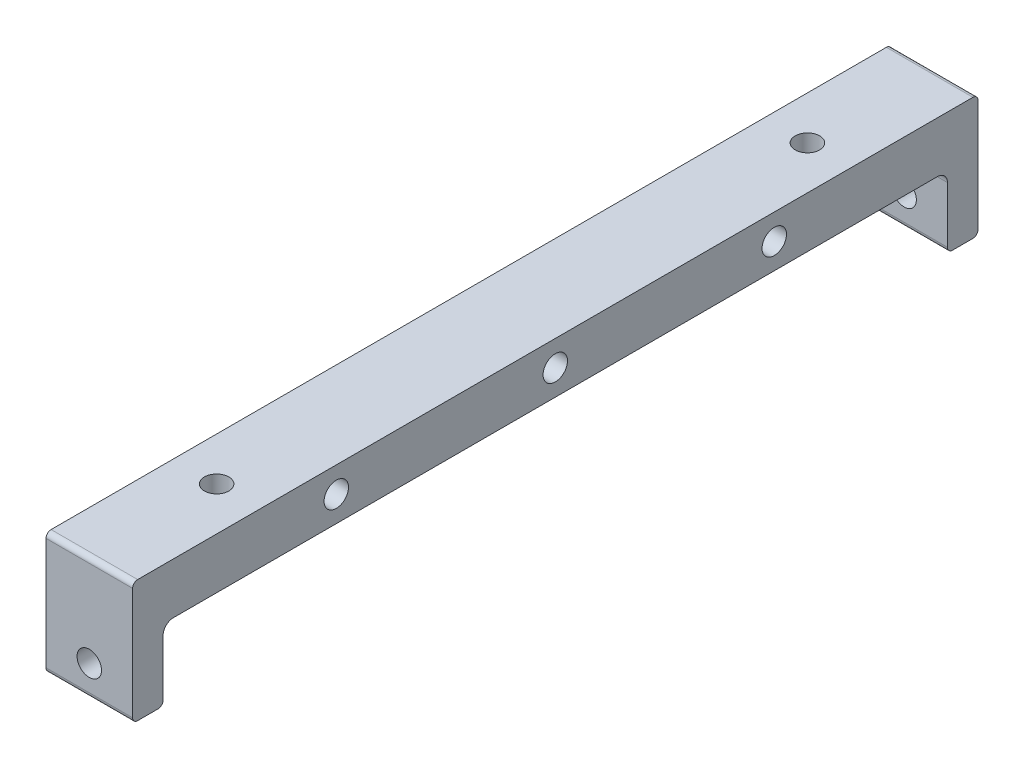
ISO-10303-21;
HEADER;
FILE_DESCRIPTION(('STEP AP214'),'2;1');
FILE_NAME('part.step','',(''),(''),'','','');
FILE_SCHEMA(('AUTOMOTIVE_DESIGN { 1 0 10303 214 1 1 1 1 }'));
ENDSEC;
DATA;
#1=APPLICATION_CONTEXT('core data for automotive mechanical design processes');
#2=APPLICATION_PROTOCOL_DEFINITION('international standard','automotive_design',2000,#1);
#3=PRODUCT_CONTEXT('',#1,'mechanical');
#4=PRODUCT('Part','Part','',(#3));
#5=PRODUCT_RELATED_PRODUCT_CATEGORY('part','',(#4));
#6=PRODUCT_DEFINITION_FORMATION('','',#4);
#7=PRODUCT_DEFINITION_CONTEXT('part definition',#1,'design');
#8=PRODUCT_DEFINITION('design','',#6,#7);
#9=PRODUCT_DEFINITION_SHAPE('','',#8);
#10=(LENGTH_UNIT() NAMED_UNIT(*) SI_UNIT(.MILLI.,.METRE.));
#11=(NAMED_UNIT(*) PLANE_ANGLE_UNIT() SI_UNIT($,.RADIAN.));
#12=(NAMED_UNIT(*) SI_UNIT($,.STERADIAN.) SOLID_ANGLE_UNIT());
#13=UNCERTAINTY_MEASURE_WITH_UNIT(LENGTH_MEASURE(1.E-05),#10,'distance_accuracy_value','');
#14=(GEOMETRIC_REPRESENTATION_CONTEXT(3) GLOBAL_UNCERTAINTY_ASSIGNED_CONTEXT((#13)) GLOBAL_UNIT_ASSIGNED_CONTEXT((#10,
#11,#12)) REPRESENTATION_CONTEXT('',''));
#15=CARTESIAN_POINT('',(0.,0.,0.));
#16=DIRECTION('',(0.,0.,1.));
#17=DIRECTION('',(1.,0.,0.));
#18=AXIS2_PLACEMENT_3D('',#15,#16,#17);
#19=CARTESIAN_POINT('',(-4.25,-6.,41.5));
#20=DIRECTION('',(0.,1.,0.));
#21=DIRECTION('',(0.,0.,1.));
#22=AXIS2_PLACEMENT_3D('',#19,#20,#21);
#23=PLANE('',#22);
#24=DIRECTION('',(0.,0.,-1.));
#25=VECTOR('',#24,1.);
#26=CARTESIAN_POINT('',(-4.25,-6.,41.5));
#27=LINE('',#26,#25);
#28=CARTESIAN_POINT('',(-4.25,-6.,41.));
#29=VERTEX_POINT('',#28);
#30=CARTESIAN_POINT('',(-4.25,-6.,39.));
#31=VERTEX_POINT('',#30);
#32=EDGE_CURVE('E271',#29,#31,#27,.T.);
#33=ORIENTED_EDGE('',*,*,#32,.T.);
#34=DIRECTION('',(1.,0.,0.));
#35=VECTOR('',#34,1.);
#36=CARTESIAN_POINT('',(-4.25,-6.,39.));
#37=LINE('',#36,#35);
#38=CARTESIAN_POINT('',(4.25,-6.,39.));
#39=VERTEX_POINT('',#38);
#40=EDGE_CURVE('E280',#31,#39,#37,.T.);
#41=ORIENTED_EDGE('',*,*,#40,.T.);
#42=DIRECTION('',(0.,0.,-1.));
#43=VECTOR('',#42,1.);
#44=CARTESIAN_POINT('',(4.25,-6.,41.5));
#45=LINE('',#44,#43);
#46=CARTESIAN_POINT('',(4.25,-6.,41.));
#47=VERTEX_POINT('',#46);
#48=EDGE_CURVE('E268',#47,#39,#45,.T.);
#49=ORIENTED_EDGE('',*,*,#48,.F.);
#50=DIRECTION('',(1.,0.,0.));
#51=VECTOR('',#50,1.);
#52=CARTESIAN_POINT('',(-4.25,-6.,41.));
#53=LINE('',#52,#51);
#54=EDGE_CURVE('E278',#47,#29,#53,.F.);
#55=ORIENTED_EDGE('',*,*,#54,.T.);
#56=EDGE_LOOP('',(#33,#41,#49,#55));
#57=FACE_BOUND('',#56,.T.);
#58=ADVANCED_FACE('F33',(#57),#23,.F.);
#59=CARTESIAN_POINT('',(4.25,-6.,41.5));
#60=DIRECTION('',(-1.,0.,0.));
#61=DIRECTION('',(0.,0.,1.));
#62=AXIS2_PLACEMENT_3D('',#59,#60,#61);
#63=PLANE('',#62);
#64=CARTESIAN_POINT('',(4.25,3.5,0.));
#65=DIRECTION('',(1.,0.,0.));
#66=DIRECTION('',(0.,0.,-1.));
#67=AXIS2_PLACEMENT_3D('',#64,#65,#66);
#68=CIRCLE('',#67,1.2);
#69=CARTESIAN_POINT('',(4.25,3.5,-1.2));
#70=VERTEX_POINT('',#69);
#71=EDGE_CURVE('E199',#70,#70,#68,.T.);
#72=ORIENTED_EDGE('',*,*,#71,.F.);
#73=EDGE_LOOP('',(#72));
#74=FACE_BOUND('',#73,.T.);
#75=CARTESIAN_POINT('',(4.25,3.5,-21.5));
#76=DIRECTION('',(1.,0.,0.));
#77=DIRECTION('',(0.,0.,-1.));
#78=AXIS2_PLACEMENT_3D('',#75,#76,#77);
#79=CIRCLE('',#78,1.19999999999999);
#80=CARTESIAN_POINT('',(4.25,3.5,-22.7));
#81=VERTEX_POINT('',#80);
#82=EDGE_CURVE('E205',#81,#81,#79,.T.);
#83=ORIENTED_EDGE('',*,*,#82,.F.);
#84=EDGE_LOOP('',(#83));
#85=FACE_BOUND('',#84,.T.);
#86=CARTESIAN_POINT('',(4.25,3.5,21.5));
#87=DIRECTION('',(1.,0.,0.));
#88=DIRECTION('',(0.,0.,-1.));
#89=AXIS2_PLACEMENT_3D('',#86,#87,#88);
#90=CIRCLE('',#89,1.19999999999999);
#91=CARTESIAN_POINT('',(4.25,3.5,20.3));
#92=VERTEX_POINT('',#91);
#93=EDGE_CURVE('E211',#92,#92,#90,.T.);
#94=ORIENTED_EDGE('',*,*,#93,.F.);
#95=EDGE_LOOP('',(#94));
#96=FACE_BOUND('',#95,.T.);
#97=ORIENTED_EDGE('',*,*,#48,.T.);
#98=CARTESIAN_POINT('',(4.25,-5.5,39.));
#99=DIRECTION('',(-1.,0.,0.));
#100=DIRECTION('',(0.,0.,1.));
#101=AXIS2_PLACEMENT_3D('',#98,#99,#100);
#102=CIRCLE('',#101,0.5);
#103=CARTESIAN_POINT('',(4.25,-5.5,38.5));
#104=VERTEX_POINT('',#103);
#105=EDGE_CURVE('E293',#39,#104,#102,.F.);
#106=ORIENTED_EDGE('',*,*,#105,.T.);
#107=DIRECTION('',(0.,-1.,0.));
#108=VECTOR('',#107,1.);
#109=CARTESIAN_POINT('',(4.25,-6.00000000000001,38.5));
#110=LINE('',#109,#108);
#111=CARTESIAN_POINT('',(4.25,0.,38.5));
#112=VERTEX_POINT('',#111);
#113=EDGE_CURVE('E221',#112,#104,#110,.T.);
#114=ORIENTED_EDGE('',*,*,#113,.F.);
#115=CARTESIAN_POINT('',(4.25,0.,37.5));
#116=DIRECTION('',(1.,0.,0.));
#117=DIRECTION('',(0.,0.,-1.));
#118=AXIS2_PLACEMENT_3D('',#115,#116,#117);
#119=CIRCLE('',#118,1.);
#120=CARTESIAN_POINT('',(4.25,1.,37.5));
#121=VERTEX_POINT('',#120);
#122=EDGE_CURVE('E241',#121,#112,#119,.T.);
#123=ORIENTED_EDGE('',*,*,#122,.F.);
#124=DIRECTION('',(0.,0.,1.));
#125=VECTOR('',#124,1.);
#126=CARTESIAN_POINT('',(4.25,1.,37.5));
#127=LINE('',#126,#125);
#128=CARTESIAN_POINT('',(4.25,1.,-37.5));
#129=VERTEX_POINT('',#128);
#130=EDGE_CURVE('E238',#129,#121,#127,.T.);
#131=ORIENTED_EDGE('',*,*,#130,.F.);
#132=CARTESIAN_POINT('',(4.25,0.,-37.5));
#133=DIRECTION('',(1.,0.,0.));
#134=DIRECTION('',(0.,0.,1.));
#135=AXIS2_PLACEMENT_3D('',#132,#133,#134);
#136=CIRCLE('',#135,1.);
#137=CARTESIAN_POINT('',(4.25,0.,-38.5));
#138=VERTEX_POINT('',#137);
#139=EDGE_CURVE('E235',#138,#129,#136,.T.);
#140=ORIENTED_EDGE('',*,*,#139,.F.);
#141=DIRECTION('',(0.,1.,0.));
#142=VECTOR('',#141,1.);
#143=CARTESIAN_POINT('',(4.25,0.,-38.5));
#144=LINE('',#143,#142);
#145=CARTESIAN_POINT('',(4.25,-5.5,-38.5));
#146=VERTEX_POINT('',#145);
#147=EDGE_CURVE('E217',#146,#138,#144,.T.);
#148=ORIENTED_EDGE('',*,*,#147,.F.);
#149=CARTESIAN_POINT('',(4.25,-5.5,-39.));
#150=DIRECTION('',(-1.,0.,0.));
#151=DIRECTION('',(0.,0.,1.));
#152=AXIS2_PLACEMENT_3D('',#149,#150,#151);
#153=CIRCLE('',#152,0.5);
#154=CARTESIAN_POINT('',(4.25,-6.,-39.));
#155=VERTEX_POINT('',#154);
#156=EDGE_CURVE('E289',#146,#155,#153,.F.);
#157=ORIENTED_EDGE('',*,*,#156,.T.);
#158=CARTESIAN_POINT('',(4.25,-6.,-41.));
#159=VERTEX_POINT('',#158);
#160=EDGE_CURVE('E262',#155,#159,#45,.T.);
#161=ORIENTED_EDGE('',*,*,#160,.T.);
#162=CARTESIAN_POINT('',(4.25,-5.5,-41.));
#163=DIRECTION('',(-1.,0.,0.));
#164=DIRECTION('',(0.,0.,1.));
#165=AXIS2_PLACEMENT_3D('',#162,#163,#164);
#166=CIRCLE('',#165,0.5);
#167=CARTESIAN_POINT('',(4.25,-5.5,-41.5));
#168=VERTEX_POINT('',#167);
#169=EDGE_CURVE('E287',#159,#168,#166,.F.);
#170=ORIENTED_EDGE('',*,*,#169,.T.);
#171=DIRECTION('',(0.,1.,0.));
#172=VECTOR('',#171,1.);
#173=CARTESIAN_POINT('',(4.25,-6.,-41.5));
#174=LINE('',#173,#172);
#175=CARTESIAN_POINT('',(4.25,5.5,-41.5));
#176=VERTEX_POINT('',#175);
#177=EDGE_CURVE('E248',#168,#176,#174,.T.);
#178=ORIENTED_EDGE('',*,*,#177,.T.);
#179=CARTESIAN_POINT('',(4.25,5.5,-41.));
#180=DIRECTION('',(-1.,0.,0.));
#181=DIRECTION('',(0.,0.,1.));
#182=AXIS2_PLACEMENT_3D('',#179,#180,#181);
#183=CIRCLE('',#182,0.5);
#184=CARTESIAN_POINT('',(4.25,6.,-41.));
#185=VERTEX_POINT('',#184);
#186=EDGE_CURVE('E283',#176,#185,#183,.F.);
#187=ORIENTED_EDGE('',*,*,#186,.T.);
#188=DIRECTION('',(0.,0.,-1.));
#189=VECTOR('',#188,1.);
#190=CARTESIAN_POINT('',(4.25,6.,41.5));
#191=LINE('',#190,#189);
#192=CARTESIAN_POINT('',(4.25,6.,41.));
#193=VERTEX_POINT('',#192);
#194=EDGE_CURVE('E275',#193,#185,#191,.T.);
#195=ORIENTED_EDGE('',*,*,#194,.F.);
#196=CARTESIAN_POINT('',(4.25,5.5,41.));
#197=DIRECTION('',(-1.,0.,0.));
#198=DIRECTION('',(0.,0.,1.));
#199=AXIS2_PLACEMENT_3D('',#196,#197,#198);
#200=CIRCLE('',#199,0.5);
#201=CARTESIAN_POINT('',(4.25,5.5,41.5));
#202=VERTEX_POINT('',#201);
#203=EDGE_CURVE('E285',#193,#202,#200,.F.);
#204=ORIENTED_EDGE('',*,*,#203,.T.);
#205=DIRECTION('',(0.,1.,0.));
#206=VECTOR('',#205,1.);
#207=CARTESIAN_POINT('',(4.25,-6.,41.5));
#208=LINE('',#207,#206);
#209=CARTESIAN_POINT('',(4.25,-5.5,41.5));
#210=VERTEX_POINT('',#209);
#211=EDGE_CURVE('E255',#210,#202,#208,.T.);
#212=ORIENTED_EDGE('',*,*,#211,.F.);
#213=CARTESIAN_POINT('',(4.25,-5.5,41.));
#214=DIRECTION('',(-1.,0.,0.));
#215=DIRECTION('',(0.,0.,1.));
#216=AXIS2_PLACEMENT_3D('',#213,#214,#215);
#217=CIRCLE('',#216,0.5);
#218=EDGE_CURVE('E291',#210,#47,#217,.F.);
#219=ORIENTED_EDGE('',*,*,#218,.T.);
#220=EDGE_LOOP('',(#97,#106,#114,#123,#131,#140,#148,#157,#161,#170,#178,#187,#195,#204,#212,#219));
#221=FACE_BOUND('',#220,.T.);
#222=ADVANCED_FACE('F348',(#74,#85,#96,#221),#63,.F.);
#223=CARTESIAN_POINT('',(-4.25,6.,41.5));
#224=DIRECTION('',(0.,-1.,0.));
#225=DIRECTION('',(0.,0.,-1.));
#226=AXIS2_PLACEMENT_3D('',#223,#224,#225);
#227=PLANE('',#226);
#228=CARTESIAN_POINT('',(0.,6.,-29.));
#229=DIRECTION('',(0.,1.,0.));
#230=DIRECTION('',(0.,0.,1.));
#231=AXIS2_PLACEMENT_3D('',#228,#229,#230);
#232=CIRCLE('',#231,1.19999999999999);
#233=CARTESIAN_POINT('',(0.,6.,-27.8));
#234=VERTEX_POINT('',#233);
#235=EDGE_CURVE('E183',#234,#234,#232,.T.);
#236=ORIENTED_EDGE('',*,*,#235,.F.);
#237=EDGE_LOOP('',(#236));
#238=FACE_BOUND('',#237,.T.);
#239=CARTESIAN_POINT('',(0.,6.,29.));
#240=DIRECTION('',(0.,1.,0.));
#241=DIRECTION('',(0.,0.,1.));
#242=AXIS2_PLACEMENT_3D('',#239,#240,#241);
#243=CIRCLE('',#242,1.19999999999999);
#244=CARTESIAN_POINT('',(0.,6.,30.2));
#245=VERTEX_POINT('',#244);
#246=EDGE_CURVE('E187',#245,#245,#243,.T.);
#247=ORIENTED_EDGE('',*,*,#246,.F.);
#248=EDGE_LOOP('',(#247));
#249=FACE_BOUND('',#248,.T.);
#250=DIRECTION('',(0.,0.,-1.));
#251=VECTOR('',#250,1.);
#252=CARTESIAN_POINT('',(-4.25,6.,41.5));
#253=LINE('',#252,#251);
#254=CARTESIAN_POINT('',(-4.25,6.,41.));
#255=VERTEX_POINT('',#254);
#256=CARTESIAN_POINT('',(-4.25,6.,-41.));
#257=VERTEX_POINT('',#256);
#258=EDGE_CURVE('E272',#255,#257,#253,.T.);
#259=ORIENTED_EDGE('',*,*,#258,.F.);
#260=DIRECTION('',(-1.,0.,0.));
#261=VECTOR('',#260,1.);
#262=CARTESIAN_POINT('',(-4.25,6.,41.));
#263=LINE('',#262,#261);
#264=EDGE_CURVE('E11',#255,#193,#263,.F.);
#265=ORIENTED_EDGE('',*,*,#264,.T.);
#266=ORIENTED_EDGE('',*,*,#194,.T.);
#267=DIRECTION('',(-1.,0.,0.));
#268=VECTOR('',#267,1.);
#269=CARTESIAN_POINT('',(-4.25,6.,-41.));
#270=LINE('',#269,#268);
#271=EDGE_CURVE('E42',#185,#257,#270,.T.);
#272=ORIENTED_EDGE('',*,*,#271,.T.);
#273=EDGE_LOOP('',(#259,#265,#266,#272));
#274=FACE_BOUND('',#273,.T.);
#275=ADVANCED_FACE('F355',(#238,#249,#274),#227,.F.);
#276=CARTESIAN_POINT('',(-4.25,-6.,41.5));
#277=DIRECTION('',(1.,0.,0.));
#278=DIRECTION('',(0.,0.,-1.));
#279=AXIS2_PLACEMENT_3D('',#276,#277,#278);
#280=PLANE('',#279);
#281=CARTESIAN_POINT('',(-4.25,3.5,-35.5));
#282=DIRECTION('',(-1.,0.,0.));
#283=DIRECTION('',(0.,0.,1.));
#284=AXIS2_PLACEMENT_3D('',#281,#282,#283);
#285=CIRCLE('',#284,1.2);
#286=CARTESIAN_POINT('',(-4.25,3.5,-34.3));
#287=VERTEX_POINT('',#286);
#288=EDGE_CURVE('E172',#287,#287,#285,.T.);
#289=ORIENTED_EDGE('',*,*,#288,.F.);
#290=EDGE_LOOP('',(#289));
#291=FACE_BOUND('',#290,.T.);
#292=CARTESIAN_POINT('',(-4.25,3.5,35.5));
#293=DIRECTION('',(-1.,0.,0.));
#294=DIRECTION('',(0.,0.,1.));
#295=AXIS2_PLACEMENT_3D('',#292,#293,#294);
#296=CIRCLE('',#295,1.2);
#297=CARTESIAN_POINT('',(-4.25,3.5,36.7));
#298=VERTEX_POINT('',#297);
#299=EDGE_CURVE('E171',#298,#298,#296,.T.);
#300=ORIENTED_EDGE('',*,*,#299,.F.);
#301=EDGE_LOOP('',(#300));
#302=FACE_BOUND('',#301,.T.);
#303=DIRECTION('',(0.,-1.,0.));
#304=VECTOR('',#303,1.);
#305=CARTESIAN_POINT('',(-4.25,-6.00000000000001,38.5));
#306=LINE('',#305,#304);
#307=CARTESIAN_POINT('',(-4.25,0.,38.5));
#308=VERTEX_POINT('',#307);
#309=CARTESIAN_POINT('',(-4.25,-5.5,38.5));
#310=VERTEX_POINT('',#309);
#311=EDGE_CURVE('E230',#308,#310,#306,.T.);
#312=ORIENTED_EDGE('',*,*,#311,.T.);
#313=CARTESIAN_POINT('',(-4.25,-5.5,39.));
#314=DIRECTION('',(1.,0.,0.));
#315=DIRECTION('',(0.,0.,-1.));
#316=AXIS2_PLACEMENT_3D('',#313,#314,#315);
#317=CIRCLE('',#316,0.5);
#318=EDGE_CURVE('E305',#310,#31,#317,.F.);
#319=ORIENTED_EDGE('',*,*,#318,.T.);
#320=ORIENTED_EDGE('',*,*,#32,.F.);
#321=CARTESIAN_POINT('',(-4.25,-5.5,41.));
#322=DIRECTION('',(1.,0.,0.));
#323=DIRECTION('',(0.,0.,-1.));
#324=AXIS2_PLACEMENT_3D('',#321,#322,#323);
#325=CIRCLE('',#324,0.5);
#326=CARTESIAN_POINT('',(-4.25,-5.5,41.5));
#327=VERTEX_POINT('',#326);
#328=EDGE_CURVE('E303',#29,#327,#325,.F.);
#329=ORIENTED_EDGE('',*,*,#328,.T.);
#330=DIRECTION('',(0.,-1.,0.));
#331=VECTOR('',#330,1.);
#332=CARTESIAN_POINT('',(-4.25,-6.,41.5));
#333=LINE('',#332,#331);
#334=CARTESIAN_POINT('',(-4.25,5.5,41.5));
#335=VERTEX_POINT('',#334);
#336=EDGE_CURVE('E258',#335,#327,#333,.T.);
#337=ORIENTED_EDGE('',*,*,#336,.F.);
#338=CARTESIAN_POINT('',(-4.25,5.5,41.));
#339=DIRECTION('',(1.,0.,0.));
#340=DIRECTION('',(0.,0.,-1.));
#341=AXIS2_PLACEMENT_3D('',#338,#339,#340);
#342=CIRCLE('',#341,0.5);
#343=EDGE_CURVE('E299',#335,#255,#342,.F.);
#344=ORIENTED_EDGE('',*,*,#343,.T.);
#345=ORIENTED_EDGE('',*,*,#258,.T.);
#346=CARTESIAN_POINT('',(-4.25,5.5,-41.));
#347=DIRECTION('',(1.,0.,0.));
#348=DIRECTION('',(0.,0.,-1.));
#349=AXIS2_PLACEMENT_3D('',#346,#347,#348);
#350=CIRCLE('',#349,0.5);
#351=CARTESIAN_POINT('',(-4.25,5.5,-41.5));
#352=VERTEX_POINT('',#351);
#353=EDGE_CURVE('E297',#257,#352,#350,.F.);
#354=ORIENTED_EDGE('',*,*,#353,.T.);
#355=DIRECTION('',(0.,-1.,0.));
#356=VECTOR('',#355,1.);
#357=CARTESIAN_POINT('',(-4.25,-6.,-41.5));
#358=LINE('',#357,#356);
#359=CARTESIAN_POINT('',(-4.25,-5.5,-41.5));
#360=VERTEX_POINT('',#359);
#361=EDGE_CURVE('E259',#352,#360,#358,.T.);
#362=ORIENTED_EDGE('',*,*,#361,.T.);
#363=CARTESIAN_POINT('',(-4.25,-5.5,-41.));
#364=DIRECTION('',(1.,0.,0.));
#365=DIRECTION('',(0.,0.,-1.));
#366=AXIS2_PLACEMENT_3D('',#363,#364,#365);
#367=CIRCLE('',#366,0.5);
#368=CARTESIAN_POINT('',(-4.25,-6.,-41.));
#369=VERTEX_POINT('',#368);
#370=EDGE_CURVE('E56',#360,#369,#367,.F.);
#371=ORIENTED_EDGE('',*,*,#370,.T.);
#372=CARTESIAN_POINT('',(-4.25,-6.,-39.));
#373=VERTEX_POINT('',#372);
#374=EDGE_CURVE('E269',#373,#369,#27,.T.);
#375=ORIENTED_EDGE('',*,*,#374,.F.);
#376=CARTESIAN_POINT('',(-4.25,-5.5,-39.));
#377=DIRECTION('',(1.,0.,0.));
#378=DIRECTION('',(0.,0.,-1.));
#379=AXIS2_PLACEMENT_3D('',#376,#377,#378);
#380=CIRCLE('',#379,0.5);
#381=CARTESIAN_POINT('',(-4.25,-5.5,-38.5));
#382=VERTEX_POINT('',#381);
#383=EDGE_CURVE('E50',#373,#382,#380,.F.);
#384=ORIENTED_EDGE('',*,*,#383,.T.);
#385=DIRECTION('',(0.,1.,0.));
#386=VECTOR('',#385,1.);
#387=CARTESIAN_POINT('',(-4.25,0.,-38.5));
#388=LINE('',#387,#386);
#389=CARTESIAN_POINT('',(-4.25,0.,-38.5));
#390=VERTEX_POINT('',#389);
#391=EDGE_CURVE('E218',#382,#390,#388,.T.);
#392=ORIENTED_EDGE('',*,*,#391,.T.);
#393=CARTESIAN_POINT('',(-4.25,0.,-37.5));
#394=DIRECTION('',(1.,0.,0.));
#395=DIRECTION('',(0.,0.,1.));
#396=AXIS2_PLACEMENT_3D('',#393,#394,#395);
#397=CIRCLE('',#396,1.);
#398=CARTESIAN_POINT('',(-4.25,1.,-37.5));
#399=VERTEX_POINT('',#398);
#400=EDGE_CURVE('E220',#390,#399,#397,.T.);
#401=ORIENTED_EDGE('',*,*,#400,.T.);
#402=DIRECTION('',(0.,0.,1.));
#403=VECTOR('',#402,1.);
#404=CARTESIAN_POINT('',(-4.25,1.,37.5));
#405=LINE('',#404,#403);
#406=CARTESIAN_POINT('',(-4.25,1.,37.5));
#407=VERTEX_POINT('',#406);
#408=EDGE_CURVE('E224',#399,#407,#405,.T.);
#409=ORIENTED_EDGE('',*,*,#408,.T.);
#410=CARTESIAN_POINT('',(-4.25,0.,37.5));
#411=DIRECTION('',(1.,0.,0.));
#412=DIRECTION('',(0.,0.,-1.));
#413=AXIS2_PLACEMENT_3D('',#410,#411,#412);
#414=CIRCLE('',#413,1.);
#415=EDGE_CURVE('E227',#407,#308,#414,.T.);
#416=ORIENTED_EDGE('',*,*,#415,.T.);
#417=EDGE_LOOP('',(#312,#319,#320,#329,#337,#344,#345,#354,#362,#371,#375,#384,#392,#401,#409,#416));
#418=FACE_BOUND('',#417,.T.);
#419=ADVANCED_FACE('F363',(#291,#302,#418),#280,.F.);
#420=ORIENTED_EDGE('',*,*,#160,.F.);
#421=DIRECTION('',(1.,0.,0.));
#422=VECTOR('',#421,1.);
#423=CARTESIAN_POINT('',(-4.25,-6.,-39.));
#424=LINE('',#423,#422);
#425=EDGE_CURVE('E319',#155,#373,#424,.F.);
#426=ORIENTED_EDGE('',*,*,#425,.T.);
#427=ORIENTED_EDGE('',*,*,#374,.T.);
#428=DIRECTION('',(1.,0.,0.));
#429=VECTOR('',#428,1.);
#430=CARTESIAN_POINT('',(4.25,-6.,-41.));
#431=LINE('',#430,#429);
#432=EDGE_CURVE('E316',#369,#159,#431,.T.);
#433=ORIENTED_EDGE('',*,*,#432,.T.);
#434=EDGE_LOOP('',(#420,#426,#427,#433));
#435=FACE_BOUND('',#434,.T.);
#436=ADVANCED_FACE('F351',(#435),#23,.F.);
#437=CARTESIAN_POINT('',(0.,0.,41.5));
#438=DIRECTION('',(0.,0.,-1.));
#439=DIRECTION('',(-1.,0.,0.));
#440=AXIS2_PLACEMENT_3D('',#437,#438,#439);
#441=PLANE('',#440);
#442=CARTESIAN_POINT('',(0.,-3.,41.5));
#443=DIRECTION('',(0.,0.,1.));
#444=DIRECTION('',(1.,0.,0.));
#445=AXIS2_PLACEMENT_3D('',#442,#443,#444);
#446=CIRCLE('',#445,1.19999999999998);
#447=CARTESIAN_POINT('',(1.19999999999998,-3.,41.5));
#448=VERTEX_POINT('',#447);
#449=EDGE_CURVE('E193',#448,#448,#446,.T.);
#450=ORIENTED_EDGE('',*,*,#449,.F.);
#451=EDGE_LOOP('',(#450));
#452=FACE_BOUND('',#451,.T.);
#453=ORIENTED_EDGE('',*,*,#336,.T.);
#454=DIRECTION('',(1.,0.,0.));
#455=VECTOR('',#454,1.);
#456=CARTESIAN_POINT('',(0.,-5.5,41.5));
#457=LINE('',#456,#455);
#458=EDGE_CURVE('E310',#327,#210,#457,.T.);
#459=ORIENTED_EDGE('',*,*,#458,.T.);
#460=ORIENTED_EDGE('',*,*,#211,.T.);
#461=DIRECTION('',(-1.,0.,0.));
#462=VECTOR('',#461,1.);
#463=CARTESIAN_POINT('',(0.,5.5,41.5));
#464=LINE('',#463,#462);
#465=EDGE_CURVE('E307',#202,#335,#464,.T.);
#466=ORIENTED_EDGE('',*,*,#465,.T.);
#467=EDGE_LOOP('',(#453,#459,#460,#466));
#468=FACE_BOUND('',#467,.T.);
#469=ADVANCED_FACE('F362',(#452,#468),#441,.F.);
#470=CARTESIAN_POINT('',(0.,0.,-41.5));
#471=DIRECTION('',(0.,0.,-1.));
#472=DIRECTION('',(-1.,0.,0.));
#473=AXIS2_PLACEMENT_3D('',#470,#471,#472);
#474=PLANE('',#473);
#475=CARTESIAN_POINT('',(0.,-3.,-41.5));
#476=DIRECTION('',(0.,0.,-1.));
#477=DIRECTION('',(-1.,0.,0.));
#478=AXIS2_PLACEMENT_3D('',#475,#476,#477);
#479=CIRCLE('',#478,1.19999999999999);
#480=CARTESIAN_POINT('',(-1.19999999999999,-3.,-41.5));
#481=VERTEX_POINT('',#480);
#482=EDGE_CURVE('E474',#481,#481,#479,.T.);
#483=ORIENTED_EDGE('',*,*,#482,.F.);
#484=EDGE_LOOP('',(#483));
#485=FACE_BOUND('',#484,.T.);
#486=ORIENTED_EDGE('',*,*,#177,.F.);
#487=DIRECTION('',(1.,0.,0.));
#488=VECTOR('',#487,1.);
#489=CARTESIAN_POINT('',(-4.25,-5.5,-41.5));
#490=LINE('',#489,#488);
#491=EDGE_CURVE('E323',#168,#360,#490,.F.);
#492=ORIENTED_EDGE('',*,*,#491,.T.);
#493=ORIENTED_EDGE('',*,*,#361,.F.);
#494=DIRECTION('',(-1.,0.,0.));
#495=VECTOR('',#494,1.);
#496=CARTESIAN_POINT('',(4.25,5.5,-41.5));
#497=LINE('',#496,#495);
#498=EDGE_CURVE('E321',#352,#176,#497,.F.);
#499=ORIENTED_EDGE('',*,*,#498,.T.);
#500=EDGE_LOOP('',(#486,#492,#493,#499));
#501=FACE_BOUND('',#500,.T.);
#502=ADVANCED_FACE('F369',(#485,#501),#474,.T.);
#503=CARTESIAN_POINT('',(-4.25,-6.00000000000001,38.5));
#504=DIRECTION('',(0.,0.,1.));
#505=DIRECTION('',(1.,0.,0.));
#506=AXIS2_PLACEMENT_3D('',#503,#504,#505);
#507=PLANE('',#506);
#508=CARTESIAN_POINT('',(0.,-3.,38.5));
#509=DIRECTION('',(0.,0.,1.));
#510=DIRECTION('',(1.,0.,0.));
#511=AXIS2_PLACEMENT_3D('',#508,#509,#510);
#512=CIRCLE('',#511,1.19999999999997);
#513=CARTESIAN_POINT('',(1.19999999999997,-3.,38.5));
#514=VERTEX_POINT('',#513);
#515=EDGE_CURVE('E196',#514,#514,#512,.T.);
#516=ORIENTED_EDGE('',*,*,#515,.T.);
#517=EDGE_LOOP('',(#516));
#518=FACE_BOUND('',#517,.T.);
#519=ORIENTED_EDGE('',*,*,#113,.T.);
#520=DIRECTION('',(1.,0.,0.));
#521=VECTOR('',#520,1.);
#522=CARTESIAN_POINT('',(-4.25,-5.5,38.5));
#523=LINE('',#522,#521);
#524=EDGE_CURVE('E295',#104,#310,#523,.F.);
#525=ORIENTED_EDGE('',*,*,#524,.T.);
#526=ORIENTED_EDGE('',*,*,#311,.F.);
#527=DIRECTION('',(1.,0.,0.));
#528=VECTOR('',#527,1.);
#529=CARTESIAN_POINT('',(-4.25,0.,38.5));
#530=LINE('',#529,#528);
#531=EDGE_CURVE('E246',#308,#112,#530,.T.);
#532=ORIENTED_EDGE('',*,*,#531,.T.);
#533=EDGE_LOOP('',(#519,#525,#526,#532));
#534=FACE_BOUND('',#533,.T.);
#535=ADVANCED_FACE('F399',(#518,#534),#507,.F.);
#536=CARTESIAN_POINT('',(-4.25,0.,37.5));
#537=DIRECTION('',(1.,0.,0.));
#538=DIRECTION('',(0.,0.,-1.));
#539=AXIS2_PLACEMENT_3D('',#536,#537,#538);
#540=CYLINDRICAL_SURFACE('',#539,1.);
#541=ORIENTED_EDGE('',*,*,#122,.T.);
#542=ORIENTED_EDGE('',*,*,#531,.F.);
#543=ORIENTED_EDGE('',*,*,#415,.F.);
#544=DIRECTION('',(1.,0.,0.));
#545=VECTOR('',#544,1.);
#546=CARTESIAN_POINT('',(-4.25,1.,37.5));
#547=LINE('',#546,#545);
#548=EDGE_CURVE('E249',#407,#121,#547,.T.);
#549=ORIENTED_EDGE('',*,*,#548,.T.);
#550=EDGE_LOOP('',(#541,#542,#543,#549));
#551=FACE_BOUND('',#550,.T.);
#552=ADVANCED_FACE('F395',(#551),#540,.F.);
#553=CARTESIAN_POINT('',(-4.25,1.,37.5));
#554=DIRECTION('',(0.,1.,0.));
#555=DIRECTION('',(0.,0.,1.));
#556=AXIS2_PLACEMENT_3D('',#553,#554,#555);
#557=PLANE('',#556);
#558=CARTESIAN_POINT('',(0.,1.,-29.));
#559=DIRECTION('',(0.,1.,0.));
#560=DIRECTION('',(0.,0.,1.));
#561=AXIS2_PLACEMENT_3D('',#558,#559,#560);
#562=CIRCLE('',#561,1.19999999999999);
#563=CARTESIAN_POINT('',(0.,1.,-27.8));
#564=VERTEX_POINT('',#563);
#565=EDGE_CURVE('E186',#564,#564,#562,.T.);
#566=ORIENTED_EDGE('',*,*,#565,.T.);
#567=EDGE_LOOP('',(#566));
#568=FACE_BOUND('',#567,.T.);
#569=CARTESIAN_POINT('',(0.,1.,29.));
#570=DIRECTION('',(0.,1.,0.));
#571=DIRECTION('',(0.,0.,1.));
#572=AXIS2_PLACEMENT_3D('',#569,#570,#571);
#573=CIRCLE('',#572,1.19999999999999);
#574=CARTESIAN_POINT('',(0.,1.,30.2));
#575=VERTEX_POINT('',#574);
#576=EDGE_CURVE('E190',#575,#575,#573,.T.);
#577=ORIENTED_EDGE('',*,*,#576,.T.);
#578=EDGE_LOOP('',(#577));
#579=FACE_BOUND('',#578,.T.);
#580=ORIENTED_EDGE('',*,*,#130,.T.);
#581=ORIENTED_EDGE('',*,*,#548,.F.);
#582=ORIENTED_EDGE('',*,*,#408,.F.);
#583=DIRECTION('',(1.,0.,0.));
#584=VECTOR('',#583,1.);
#585=CARTESIAN_POINT('',(-4.25,1.,-37.5));
#586=LINE('',#585,#584);
#587=EDGE_CURVE('E251',#399,#129,#586,.T.);
#588=ORIENTED_EDGE('',*,*,#587,.T.);
#589=EDGE_LOOP('',(#580,#581,#582,#588));
#590=FACE_BOUND('',#589,.T.);
#591=ADVANCED_FACE('F329',(#568,#579,#590),#557,.F.);
#592=CARTESIAN_POINT('',(-4.25,0.,-37.5));
#593=DIRECTION('',(1.,0.,0.));
#594=DIRECTION('',(0.,0.,-1.));
#595=AXIS2_PLACEMENT_3D('',#592,#593,#594);
#596=CYLINDRICAL_SURFACE('',#595,1.);
#597=ORIENTED_EDGE('',*,*,#139,.T.);
#598=ORIENTED_EDGE('',*,*,#587,.F.);
#599=ORIENTED_EDGE('',*,*,#400,.F.);
#600=DIRECTION('',(1.,0.,0.));
#601=VECTOR('',#600,1.);
#602=CARTESIAN_POINT('',(-4.25,0.,-38.5));
#603=LINE('',#602,#601);
#604=EDGE_CURVE('E233',#390,#138,#603,.T.);
#605=ORIENTED_EDGE('',*,*,#604,.T.);
#606=EDGE_LOOP('',(#597,#598,#599,#605));
#607=FACE_BOUND('',#606,.T.);
#608=ADVANCED_FACE('F389',(#607),#596,.F.);
#609=CARTESIAN_POINT('',(-4.25,0.,-38.5));
#610=DIRECTION('',(0.,0.,-1.));
#611=DIRECTION('',(-1.,0.,0.));
#612=AXIS2_PLACEMENT_3D('',#609,#610,#611);
#613=PLANE('',#612);
#614=CARTESIAN_POINT('',(0.,-3.,-38.5));
#615=DIRECTION('',(0.,0.,-1.));
#616=DIRECTION('',(-1.,0.,0.));
#617=AXIS2_PLACEMENT_3D('',#614,#615,#616);
#618=CIRCLE('',#617,1.19999999999999);
#619=CARTESIAN_POINT('',(-1.19999999999999,-3.,-38.5));
#620=VERTEX_POINT('',#619);
#621=EDGE_CURVE('E37',#620,#620,#618,.T.);
#622=ORIENTED_EDGE('',*,*,#621,.T.);
#623=EDGE_LOOP('',(#622));
#624=FACE_BOUND('',#623,.T.);
#625=ORIENTED_EDGE('',*,*,#391,.F.);
#626=DIRECTION('',(1.,0.,0.));
#627=VECTOR('',#626,1.);
#628=CARTESIAN_POINT('',(-4.25,-5.5,-38.5));
#629=LINE('',#628,#627);
#630=EDGE_CURVE('E313',#382,#146,#629,.T.);
#631=ORIENTED_EDGE('',*,*,#630,.T.);
#632=ORIENTED_EDGE('',*,*,#147,.T.);
#633=ORIENTED_EDGE('',*,*,#604,.F.);
#634=EDGE_LOOP('',(#625,#631,#632,#633));
#635=FACE_BOUND('',#634,.T.);
#636=ADVANCED_FACE('F382',(#624,#635),#613,.F.);
#637=CARTESIAN_POINT('',(-4.25,-5.5,39.));
#638=DIRECTION('',(1.,0.,0.));
#639=DIRECTION('',(0.,0.,-1.));
#640=AXIS2_PLACEMENT_3D('',#637,#638,#639);
#641=CYLINDRICAL_SURFACE('',#640,0.5);
#642=ORIENTED_EDGE('',*,*,#318,.F.);
#643=ORIENTED_EDGE('',*,*,#524,.F.);
#644=ORIENTED_EDGE('',*,*,#105,.F.);
#645=ORIENTED_EDGE('',*,*,#40,.F.);
#646=EDGE_LOOP('',(#642,#643,#644,#645));
#647=FACE_BOUND('',#646,.T.);
#648=ADVANCED_FACE('F405',(#647),#641,.T.);
#649=CARTESIAN_POINT('',(0.,-5.5,41.));
#650=DIRECTION('',(1.,0.,0.));
#651=DIRECTION('',(0.,0.,-1.));
#652=AXIS2_PLACEMENT_3D('',#649,#650,#651);
#653=CYLINDRICAL_SURFACE('',#652,0.5);
#654=ORIENTED_EDGE('',*,*,#328,.F.);
#655=ORIENTED_EDGE('',*,*,#54,.F.);
#656=ORIENTED_EDGE('',*,*,#218,.F.);
#657=ORIENTED_EDGE('',*,*,#458,.F.);
#658=EDGE_LOOP('',(#654,#655,#656,#657));
#659=FACE_BOUND('',#658,.T.);
#660=ADVANCED_FACE('F412',(#659),#653,.T.);
#661=CARTESIAN_POINT('',(-4.25,-5.5,-39.));
#662=DIRECTION('',(1.,0.,0.));
#663=DIRECTION('',(0.,0.,-1.));
#664=AXIS2_PLACEMENT_3D('',#661,#662,#663);
#665=CYLINDRICAL_SURFACE('',#664,0.5);
#666=ORIENTED_EDGE('',*,*,#383,.F.);
#667=ORIENTED_EDGE('',*,*,#425,.F.);
#668=ORIENTED_EDGE('',*,*,#156,.F.);
#669=ORIENTED_EDGE('',*,*,#630,.F.);
#670=EDGE_LOOP('',(#666,#667,#668,#669));
#671=FACE_BOUND('',#670,.T.);
#672=ADVANCED_FACE('F378',(#671),#665,.T.);
#673=CARTESIAN_POINT('',(-4.25,-5.5,-41.));
#674=DIRECTION('',(-1.,0.,0.));
#675=DIRECTION('',(0.,0.,1.));
#676=AXIS2_PLACEMENT_3D('',#673,#674,#675);
#677=CYLINDRICAL_SURFACE('',#676,0.5);
#678=ORIENTED_EDGE('',*,*,#370,.F.);
#679=ORIENTED_EDGE('',*,*,#491,.F.);
#680=ORIENTED_EDGE('',*,*,#169,.F.);
#681=ORIENTED_EDGE('',*,*,#432,.F.);
#682=EDGE_LOOP('',(#678,#679,#680,#681));
#683=FACE_BOUND('',#682,.T.);
#684=ADVANCED_FACE('F432',(#683),#677,.T.);
#685=CARTESIAN_POINT('',(0.,5.5,41.));
#686=DIRECTION('',(-1.,0.,0.));
#687=DIRECTION('',(0.,0.,1.));
#688=AXIS2_PLACEMENT_3D('',#685,#686,#687);
#689=CYLINDRICAL_SURFACE('',#688,0.5);
#690=ORIENTED_EDGE('',*,*,#203,.F.);
#691=ORIENTED_EDGE('',*,*,#264,.F.);
#692=ORIENTED_EDGE('',*,*,#343,.F.);
#693=ORIENTED_EDGE('',*,*,#465,.F.);
#694=EDGE_LOOP('',(#690,#691,#692,#693));
#695=FACE_BOUND('',#694,.T.);
#696=ADVANCED_FACE('F423',(#695),#689,.T.);
#697=CARTESIAN_POINT('',(-4.25,5.5,-41.));
#698=DIRECTION('',(1.,0.,0.));
#699=DIRECTION('',(0.,0.,-1.));
#700=AXIS2_PLACEMENT_3D('',#697,#698,#699);
#701=CYLINDRICAL_SURFACE('',#700,0.5);
#702=ORIENTED_EDGE('',*,*,#186,.F.);
#703=ORIENTED_EDGE('',*,*,#498,.F.);
#704=ORIENTED_EDGE('',*,*,#353,.F.);
#705=ORIENTED_EDGE('',*,*,#271,.F.);
#706=EDGE_LOOP('',(#702,#703,#704,#705));
#707=FACE_BOUND('',#706,.T.);
#708=ADVANCED_FACE('F35',(#707),#701,.T.);
#709=CARTESIAN_POINT('',(-0.750000000000002,3.5,21.5));
#710=DIRECTION('',(1.,0.,0.));
#711=DIRECTION('',(0.,0.,-1.));
#712=AXIS2_PLACEMENT_3D('',#709,#710,#711);
#713=CONICAL_SURFACE('',#712,1.2,1.02974425867665);
#714=CARTESIAN_POINT('',(-1.47103274283307,3.5,21.5));
#715=VERTEX_POINT('',#714);
#716=VERTEX_LOOP('',#715);
#717=FACE_BOUND('',#716,.T.);
#718=CARTESIAN_POINT('',(-0.750000000000002,3.5,21.5));
#719=DIRECTION('',(1.,0.,0.));
#720=DIRECTION('',(0.,0.,-1.));
#721=AXIS2_PLACEMENT_3D('',#718,#719,#720);
#722=CIRCLE('',#721,1.2);
#723=CARTESIAN_POINT('',(-0.750000000000002,3.5,20.3));
#724=VERTEX_POINT('',#723);
#725=EDGE_CURVE('E214',#724,#724,#722,.T.);
#726=ORIENTED_EDGE('',*,*,#725,.T.);
#727=EDGE_LOOP('',(#726));
#728=FACE_BOUND('',#727,.T.);
#729=ADVANCED_FACE('F558',(#717,#728),#713,.F.);
#730=CARTESIAN_POINT('',(4.25,3.5,21.5));
#731=DIRECTION('',(1.,0.,0.));
#732=DIRECTION('',(0.,0.,-1.));
#733=AXIS2_PLACEMENT_3D('',#730,#731,#732);
#734=CYLINDRICAL_SURFACE('',#733,1.19999999999999);
#735=ORIENTED_EDGE('',*,*,#725,.F.);
#736=EDGE_LOOP('',(#735));
#737=FACE_BOUND('',#736,.T.);
#738=ORIENTED_EDGE('',*,*,#93,.T.);
#739=EDGE_LOOP('',(#738));
#740=FACE_BOUND('',#739,.T.);
#741=ADVANCED_FACE('F566',(#737,#740),#734,.F.);
#742=CARTESIAN_POINT('',(-0.750000000000002,3.5,-21.5));
#743=DIRECTION('',(1.,0.,0.));
#744=DIRECTION('',(0.,0.,-1.));
#745=AXIS2_PLACEMENT_3D('',#742,#743,#744);
#746=CONICAL_SURFACE('',#745,1.2,1.02974425867665);
#747=CARTESIAN_POINT('',(-1.47103274283307,3.5,-21.5));
#748=VERTEX_POINT('',#747);
#749=VERTEX_LOOP('',#748);
#750=FACE_BOUND('',#749,.T.);
#751=CARTESIAN_POINT('',(-0.750000000000002,3.5,-21.5));
#752=DIRECTION('',(1.,0.,0.));
#753=DIRECTION('',(0.,0.,-1.));
#754=AXIS2_PLACEMENT_3D('',#751,#752,#753);
#755=CIRCLE('',#754,1.2);
#756=CARTESIAN_POINT('',(-0.750000000000002,3.5,-22.7));
#757=VERTEX_POINT('',#756);
#758=EDGE_CURVE('E208',#757,#757,#755,.T.);
#759=ORIENTED_EDGE('',*,*,#758,.T.);
#760=EDGE_LOOP('',(#759));
#761=FACE_BOUND('',#760,.T.);
#762=ADVANCED_FACE('F576',(#750,#761),#746,.F.);
#763=CARTESIAN_POINT('',(4.25,3.5,-21.5));
#764=DIRECTION('',(1.,0.,0.));
#765=DIRECTION('',(0.,0.,-1.));
#766=AXIS2_PLACEMENT_3D('',#763,#764,#765);
#767=CYLINDRICAL_SURFACE('',#766,1.19999999999999);
#768=ORIENTED_EDGE('',*,*,#758,.F.);
#769=EDGE_LOOP('',(#768));
#770=FACE_BOUND('',#769,.T.);
#771=ORIENTED_EDGE('',*,*,#82,.T.);
#772=EDGE_LOOP('',(#771));
#773=FACE_BOUND('',#772,.T.);
#774=ADVANCED_FACE('F586',(#770,#773),#767,.F.);
#775=CARTESIAN_POINT('',(0.249999999999999,3.5,0.));
#776=DIRECTION('',(1.,0.,0.));
#777=DIRECTION('',(0.,0.,-1.));
#778=AXIS2_PLACEMENT_3D('',#775,#776,#777);
#779=CONICAL_SURFACE('',#778,1.2,1.02974425867665);
#780=CARTESIAN_POINT('',(-0.471032742833073,3.5,0.));
#781=VERTEX_POINT('',#780);
#782=VERTEX_LOOP('',#781);
#783=FACE_BOUND('',#782,.T.);
#784=CARTESIAN_POINT('',(0.249999999999999,3.5,0.));
#785=DIRECTION('',(1.,0.,0.));
#786=DIRECTION('',(0.,0.,-1.));
#787=AXIS2_PLACEMENT_3D('',#784,#785,#786);
#788=CIRCLE('',#787,1.2);
#789=CARTESIAN_POINT('',(0.249999999999999,3.5,-1.2));
#790=VERTEX_POINT('',#789);
#791=EDGE_CURVE('E202',#790,#790,#788,.T.);
#792=ORIENTED_EDGE('',*,*,#791,.T.);
#793=EDGE_LOOP('',(#792));
#794=FACE_BOUND('',#793,.T.);
#795=ADVANCED_FACE('F596',(#783,#794),#779,.F.);
#796=CARTESIAN_POINT('',(4.25,3.5,0.));
#797=DIRECTION('',(1.,0.,0.));
#798=DIRECTION('',(0.,0.,-1.));
#799=AXIS2_PLACEMENT_3D('',#796,#797,#798);
#800=CYLINDRICAL_SURFACE('',#799,1.2);
#801=ORIENTED_EDGE('',*,*,#791,.F.);
#802=EDGE_LOOP('',(#801));
#803=FACE_BOUND('',#802,.T.);
#804=ORIENTED_EDGE('',*,*,#71,.T.);
#805=EDGE_LOOP('',(#804));
#806=FACE_BOUND('',#805,.T.);
#807=ADVANCED_FACE('F613',(#803,#806),#800,.F.);
#808=CARTESIAN_POINT('',(0.,-3.,41.5));
#809=DIRECTION('',(0.,0.,1.));
#810=DIRECTION('',(1.,0.,0.));
#811=AXIS2_PLACEMENT_3D('',#808,#809,#810);
#812=CYLINDRICAL_SURFACE('',#811,1.19999999999997);
#813=ORIENTED_EDGE('',*,*,#449,.T.);
#814=EDGE_LOOP('',(#813));
#815=FACE_BOUND('',#814,.T.);
#816=ORIENTED_EDGE('',*,*,#515,.F.);
#817=EDGE_LOOP('',(#816));
#818=FACE_BOUND('',#817,.T.);
#819=ADVANCED_FACE('F344',(#815,#818),#812,.F.);
#820=CARTESIAN_POINT('',(0.,6.,29.));
#821=DIRECTION('',(0.,1.,0.));
#822=DIRECTION('',(0.,0.,1.));
#823=AXIS2_PLACEMENT_3D('',#820,#821,#822);
#824=CYLINDRICAL_SURFACE('',#823,1.19999999999999);
#825=ORIENTED_EDGE('',*,*,#246,.T.);
#826=EDGE_LOOP('',(#825));
#827=FACE_BOUND('',#826,.T.);
#828=ORIENTED_EDGE('',*,*,#576,.F.);
#829=EDGE_LOOP('',(#828));
#830=FACE_BOUND('',#829,.T.);
#831=ADVANCED_FACE('F335',(#827,#830),#824,.F.);
#832=CARTESIAN_POINT('',(0.,6.,-29.));
#833=DIRECTION('',(0.,1.,0.));
#834=DIRECTION('',(0.,0.,1.));
#835=AXIS2_PLACEMENT_3D('',#832,#833,#834);
#836=CYLINDRICAL_SURFACE('',#835,1.19999999999999);
#837=ORIENTED_EDGE('',*,*,#235,.T.);
#838=EDGE_LOOP('',(#837));
#839=FACE_BOUND('',#838,.T.);
#840=ORIENTED_EDGE('',*,*,#565,.F.);
#841=EDGE_LOOP('',(#840));
#842=FACE_BOUND('',#841,.T.);
#843=ADVANCED_FACE('F332',(#839,#842),#836,.F.);
#844=CARTESIAN_POINT('',(0.749999999999999,3.5,35.5));
#845=DIRECTION('',(-1.,0.,0.));
#846=DIRECTION('',(0.,0.,1.));
#847=AXIS2_PLACEMENT_3D('',#844,#845,#846);
#848=CONICAL_SURFACE('',#847,1.2,1.02974425867665);
#849=CARTESIAN_POINT('',(1.47103274283307,3.5,35.5));
#850=VERTEX_POINT('',#849);
#851=VERTEX_LOOP('',#850);
#852=FACE_BOUND('',#851,.T.);
#853=CARTESIAN_POINT('',(0.749999999999999,3.5,35.5));
#854=DIRECTION('',(-1.,0.,0.));
#855=DIRECTION('',(0.,0.,1.));
#856=AXIS2_PLACEMENT_3D('',#853,#854,#855);
#857=CIRCLE('',#856,1.2);
#858=CARTESIAN_POINT('',(0.749999999999999,3.5,36.7));
#859=VERTEX_POINT('',#858);
#860=EDGE_CURVE('E175',#859,#859,#857,.T.);
#861=ORIENTED_EDGE('',*,*,#860,.T.);
#862=EDGE_LOOP('',(#861));
#863=FACE_BOUND('',#862,.T.);
#864=ADVANCED_FACE('F334',(#852,#863),#848,.F.);
#865=CARTESIAN_POINT('',(-4.25,3.5,35.5));
#866=DIRECTION('',(-1.,0.,0.));
#867=DIRECTION('',(0.,0.,1.));
#868=AXIS2_PLACEMENT_3D('',#865,#866,#867);
#869=CYLINDRICAL_SURFACE('',#868,1.2);
#870=ORIENTED_EDGE('',*,*,#860,.F.);
#871=EDGE_LOOP('',(#870));
#872=FACE_BOUND('',#871,.T.);
#873=ORIENTED_EDGE('',*,*,#299,.T.);
#874=EDGE_LOOP('',(#873));
#875=FACE_BOUND('',#874,.T.);
#876=ADVANCED_FACE('F165',(#872,#875),#869,.F.);
#877=CARTESIAN_POINT('',(0.749999999999999,3.5,-35.5));
#878=DIRECTION('',(-1.,0.,0.));
#879=DIRECTION('',(0.,0.,1.));
#880=AXIS2_PLACEMENT_3D('',#877,#878,#879);
#881=CONICAL_SURFACE('',#880,1.2,1.02974425867665);
#882=CARTESIAN_POINT('',(1.47103274283307,3.5,-35.5));
#883=VERTEX_POINT('',#882);
#884=VERTEX_LOOP('',#883);
#885=FACE_BOUND('',#884,.T.);
#886=CARTESIAN_POINT('',(0.749999999999999,3.5,-35.5));
#887=DIRECTION('',(-1.,0.,0.));
#888=DIRECTION('',(0.,0.,1.));
#889=AXIS2_PLACEMENT_3D('',#886,#887,#888);
#890=CIRCLE('',#889,1.2);
#891=CARTESIAN_POINT('',(0.749999999999999,3.5,-34.3));
#892=VERTEX_POINT('',#891);
#893=EDGE_CURVE('E169',#892,#892,#890,.T.);
#894=ORIENTED_EDGE('',*,*,#893,.T.);
#895=EDGE_LOOP('',(#894));
#896=FACE_BOUND('',#895,.T.);
#897=ADVANCED_FACE('F161',(#885,#896),#881,.F.);
#898=CARTESIAN_POINT('',(-4.25,3.5,-35.5));
#899=DIRECTION('',(-1.,0.,0.));
#900=DIRECTION('',(0.,0.,1.));
#901=AXIS2_PLACEMENT_3D('',#898,#899,#900);
#902=CYLINDRICAL_SURFACE('',#901,1.2);
#903=ORIENTED_EDGE('',*,*,#893,.F.);
#904=EDGE_LOOP('',(#903));
#905=FACE_BOUND('',#904,.T.);
#906=ORIENTED_EDGE('',*,*,#288,.T.);
#907=EDGE_LOOP('',(#906));
#908=FACE_BOUND('',#907,.T.);
#909=ADVANCED_FACE('F164',(#905,#908),#902,.F.);
#910=CARTESIAN_POINT('',(0.,-3.,-41.5));
#911=DIRECTION('',(0.,0.,-1.));
#912=DIRECTION('',(-1.,0.,0.));
#913=AXIS2_PLACEMENT_3D('',#910,#911,#912);
#914=CYLINDRICAL_SURFACE('',#913,1.19999999999999);
#915=ORIENTED_EDGE('',*,*,#482,.T.);
#916=EDGE_LOOP('',(#915));
#917=FACE_BOUND('',#916,.T.);
#918=ORIENTED_EDGE('',*,*,#621,.F.);
#919=EDGE_LOOP('',(#918));
#920=FACE_BOUND('',#919,.T.);
#921=ADVANCED_FACE('F479',(#917,#920),#914,.F.);
#922=CLOSED_SHELL('',(#58,#222,#275,#419,#436,#469,#502,#535,#552,#591,#608,#636,#648,#660,#672,
#684,#696,#708,#729,#741,#762,#774,#795,#807,#819,#831,#843,#864,#876,#897,#909,#921));
#923=MANIFOLD_SOLID_BREP('B2',#922);
#924=ADVANCED_BREP_SHAPE_REPRESENTATION('',(#18,#923),#14);
#925=SHAPE_DEFINITION_REPRESENTATION(#9,#924);
ENDSEC;
END-ISO-10303-21;
